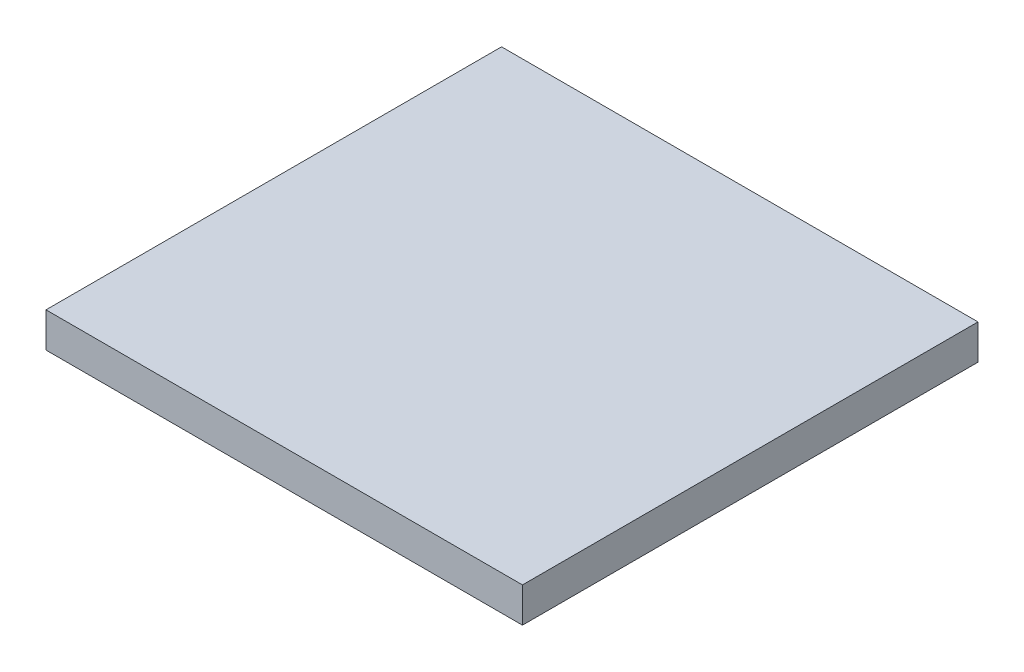
ISO-10303-21;
HEADER;
FILE_DESCRIPTION(('STEP AP214'),'2;1');
FILE_NAME('part.step','',(''),(''),'','','');
FILE_SCHEMA(('AUTOMOTIVE_DESIGN { 1 0 10303 214 1 1 1 1 }'));
ENDSEC;
DATA;
#1=APPLICATION_CONTEXT('core data for automotive mechanical design processes');
#2=APPLICATION_PROTOCOL_DEFINITION('international standard','automotive_design',2000,#1);
#3=PRODUCT_CONTEXT('',#1,'mechanical');
#4=PRODUCT('Part','Part','',(#3));
#5=PRODUCT_RELATED_PRODUCT_CATEGORY('part','',(#4));
#6=PRODUCT_DEFINITION_FORMATION('','',#4);
#7=PRODUCT_DEFINITION_CONTEXT('part definition',#1,'design');
#8=PRODUCT_DEFINITION('design','',#6,#7);
#9=PRODUCT_DEFINITION_SHAPE('','',#8);
#10=(LENGTH_UNIT() NAMED_UNIT(*) SI_UNIT(.MILLI.,.METRE.));
#11=(NAMED_UNIT(*) PLANE_ANGLE_UNIT() SI_UNIT($,.RADIAN.));
#12=(NAMED_UNIT(*) SI_UNIT($,.STERADIAN.) SOLID_ANGLE_UNIT());
#13=UNCERTAINTY_MEASURE_WITH_UNIT(LENGTH_MEASURE(1.E-05),#10,'distance_accuracy_value','');
#14=(GEOMETRIC_REPRESENTATION_CONTEXT(3) GLOBAL_UNCERTAINTY_ASSIGNED_CONTEXT((#13)) GLOBAL_UNIT_ASSIGNED_CONTEXT((#10,
#11,#12)) REPRESENTATION_CONTEXT('',''));
#15=CARTESIAN_POINT('',(0.,0.,0.));
#16=DIRECTION('',(0.,0.,1.));
#17=DIRECTION('',(1.,0.,0.));
#18=AXIS2_PLACEMENT_3D('',#15,#16,#17);
#19=CARTESIAN_POINT('',(-34.15,5.,-32.65));
#20=DIRECTION('',(1.,0.,0.));
#21=DIRECTION('',(0.,0.,-1.));
#22=AXIS2_PLACEMENT_3D('',#19,#20,#21);
#23=PLANE('',#22);
#24=DIRECTION('',(0.,0.,1.));
#25=VECTOR('',#24,1.);
#26=CARTESIAN_POINT('',(-34.15,0.,-32.65));
#27=LINE('',#26,#25);
#28=CARTESIAN_POINT('',(-34.15,0.,-32.65));
#29=VERTEX_POINT('',#28);
#30=CARTESIAN_POINT('',(-34.15,0.,32.65));
#31=VERTEX_POINT('',#30);
#32=EDGE_CURVE('E108',#29,#31,#27,.T.);
#33=ORIENTED_EDGE('',*,*,#32,.T.);
#34=DIRECTION('',(0.,-1.,0.));
#35=VECTOR('',#34,1.);
#36=CARTESIAN_POINT('',(-34.15,5.,32.65));
#37=LINE('',#36,#35);
#38=CARTESIAN_POINT('',(-34.15,5.,32.65));
#39=VERTEX_POINT('',#38);
#40=EDGE_CURVE('E11',#39,#31,#37,.T.);
#41=ORIENTED_EDGE('',*,*,#40,.F.);
#42=DIRECTION('',(0.,0.,1.));
#43=VECTOR('',#42,1.);
#44=CARTESIAN_POINT('',(-34.15,5.,-32.65));
#45=LINE('',#44,#43);
#46=CARTESIAN_POINT('',(-34.15,5.,-32.65));
#47=VERTEX_POINT('',#46);
#48=EDGE_CURVE('E96',#47,#39,#45,.T.);
#49=ORIENTED_EDGE('',*,*,#48,.F.);
#50=DIRECTION('',(0.,-1.,0.));
#51=VECTOR('',#50,1.);
#52=CARTESIAN_POINT('',(-34.15,5.,-32.65));
#53=LINE('',#52,#51);
#54=EDGE_CURVE('E104',#47,#29,#53,.T.);
#55=ORIENTED_EDGE('',*,*,#54,.T.);
#56=EDGE_LOOP('',(#33,#41,#49,#55));
#57=FACE_BOUND('',#56,.T.);
#58=ADVANCED_FACE('F45',(#57),#23,.F.);
#59=CARTESIAN_POINT('',(34.15,5.,32.65));
#60=DIRECTION('',(0.,0.,-1.));
#61=DIRECTION('',(-1.,0.,0.));
#62=AXIS2_PLACEMENT_3D('',#59,#60,#61);
#63=PLANE('',#62);
#64=DIRECTION('',(1.,0.,0.));
#65=VECTOR('',#64,1.);
#66=CARTESIAN_POINT('',(34.15,0.,32.65));
#67=LINE('',#66,#65);
#68=CARTESIAN_POINT('',(34.15,0.,32.65));
#69=VERTEX_POINT('',#68);
#70=EDGE_CURVE('E100',#31,#69,#67,.T.);
#71=ORIENTED_EDGE('',*,*,#70,.T.);
#72=DIRECTION('',(0.,-1.,0.));
#73=VECTOR('',#72,1.);
#74=CARTESIAN_POINT('',(34.15,5.,32.65));
#75=LINE('',#74,#73);
#76=CARTESIAN_POINT('',(34.15,5.,32.65));
#77=VERTEX_POINT('',#76);
#78=EDGE_CURVE('E53',#77,#69,#75,.T.);
#79=ORIENTED_EDGE('',*,*,#78,.F.);
#80=DIRECTION('',(1.,0.,0.));
#81=VECTOR('',#80,1.);
#82=CARTESIAN_POINT('',(34.15,5.,32.65));
#83=LINE('',#82,#81);
#84=EDGE_CURVE('E91',#39,#77,#83,.T.);
#85=ORIENTED_EDGE('',*,*,#84,.F.);
#86=ORIENTED_EDGE('',*,*,#40,.T.);
#87=EDGE_LOOP('',(#71,#79,#85,#86));
#88=FACE_BOUND('',#87,.T.);
#89=ADVANCED_FACE('F99',(#88),#63,.F.);
#90=CARTESIAN_POINT('',(34.15,5.,-32.65));
#91=DIRECTION('',(-1.,0.,0.));
#92=DIRECTION('',(0.,0.,1.));
#93=AXIS2_PLACEMENT_3D('',#90,#91,#92);
#94=PLANE('',#93);
#95=DIRECTION('',(0.,0.,-1.));
#96=VECTOR('',#95,1.);
#97=CARTESIAN_POINT('',(34.15,0.,-32.65));
#98=LINE('',#97,#96);
#99=CARTESIAN_POINT('',(34.15,0.,-32.65));
#100=VERTEX_POINT('',#99);
#101=EDGE_CURVE('E78',#69,#100,#98,.T.);
#102=ORIENTED_EDGE('',*,*,#101,.T.);
#103=DIRECTION('',(0.,-1.,0.));
#104=VECTOR('',#103,1.);
#105=CARTESIAN_POINT('',(34.15,5.,-32.65));
#106=LINE('',#105,#104);
#107=CARTESIAN_POINT('',(34.15,5.,-32.65));
#108=VERTEX_POINT('',#107);
#109=EDGE_CURVE('E101',#108,#100,#106,.T.);
#110=ORIENTED_EDGE('',*,*,#109,.F.);
#111=DIRECTION('',(0.,0.,-1.));
#112=VECTOR('',#111,1.);
#113=CARTESIAN_POINT('',(34.15,5.,-32.65));
#114=LINE('',#113,#112);
#115=EDGE_CURVE('E94',#77,#108,#114,.T.);
#116=ORIENTED_EDGE('',*,*,#115,.F.);
#117=ORIENTED_EDGE('',*,*,#78,.T.);
#118=EDGE_LOOP('',(#102,#110,#116,#117));
#119=FACE_BOUND('',#118,.T.);
#120=ADVANCED_FACE('F102',(#119),#94,.F.);
#121=CARTESIAN_POINT('',(34.15,5.,-32.65));
#122=DIRECTION('',(0.,0.,1.));
#123=DIRECTION('',(1.,0.,0.));
#124=AXIS2_PLACEMENT_3D('',#121,#122,#123);
#125=PLANE('',#124);
#126=DIRECTION('',(-1.,0.,0.));
#127=VECTOR('',#126,1.);
#128=CARTESIAN_POINT('',(34.15,0.,-32.65));
#129=LINE('',#128,#127);
#130=EDGE_CURVE('E84',#100,#29,#129,.T.);
#131=ORIENTED_EDGE('',*,*,#130,.T.);
#132=ORIENTED_EDGE('',*,*,#54,.F.);
#133=DIRECTION('',(-1.,0.,0.));
#134=VECTOR('',#133,1.);
#135=CARTESIAN_POINT('',(34.15,5.,-32.65));
#136=LINE('',#135,#134);
#137=EDGE_CURVE('E61',#108,#47,#136,.T.);
#138=ORIENTED_EDGE('',*,*,#137,.F.);
#139=ORIENTED_EDGE('',*,*,#109,.T.);
#140=EDGE_LOOP('',(#131,#132,#138,#139));
#141=FACE_BOUND('',#140,.T.);
#142=ADVANCED_FACE('F115',(#141),#125,.F.);
#143=CARTESIAN_POINT('',(0.,5.,0.));
#144=DIRECTION('',(0.,-1.,0.));
#145=DIRECTION('',(0.,0.,-1.));
#146=AXIS2_PLACEMENT_3D('',#143,#144,#145);
#147=PLANE('',#146);
#148=ORIENTED_EDGE('',*,*,#48,.T.);
#149=ORIENTED_EDGE('',*,*,#84,.T.);
#150=ORIENTED_EDGE('',*,*,#115,.T.);
#151=ORIENTED_EDGE('',*,*,#137,.T.);
#152=EDGE_LOOP('',(#148,#149,#150,#151));
#153=FACE_BOUND('',#152,.T.);
#154=ADVANCED_FACE('F92',(#153),#147,.F.);
#155=CARTESIAN_POINT('',(0.,0.,0.));
#156=DIRECTION('',(0.,-1.,0.));
#157=DIRECTION('',(0.,0.,-1.));
#158=AXIS2_PLACEMENT_3D('',#155,#156,#157);
#159=PLANE('',#158);
#160=ORIENTED_EDGE('',*,*,#32,.F.);
#161=ORIENTED_EDGE('',*,*,#130,.F.);
#162=ORIENTED_EDGE('',*,*,#101,.F.);
#163=ORIENTED_EDGE('',*,*,#70,.F.);
#164=EDGE_LOOP('',(#160,#161,#162,#163));
#165=FACE_BOUND('',#164,.T.);
#166=ADVANCED_FACE('F118',(#165),#159,.T.);
#167=CLOSED_SHELL('',(#58,#89,#120,#142,#154,#166));
#168=MANIFOLD_SOLID_BREP('B2',#167);
#169=ADVANCED_BREP_SHAPE_REPRESENTATION('',(#18,#168),#14);
#170=SHAPE_DEFINITION_REPRESENTATION(#9,#169);
ENDSEC;
END-ISO-10303-21;
